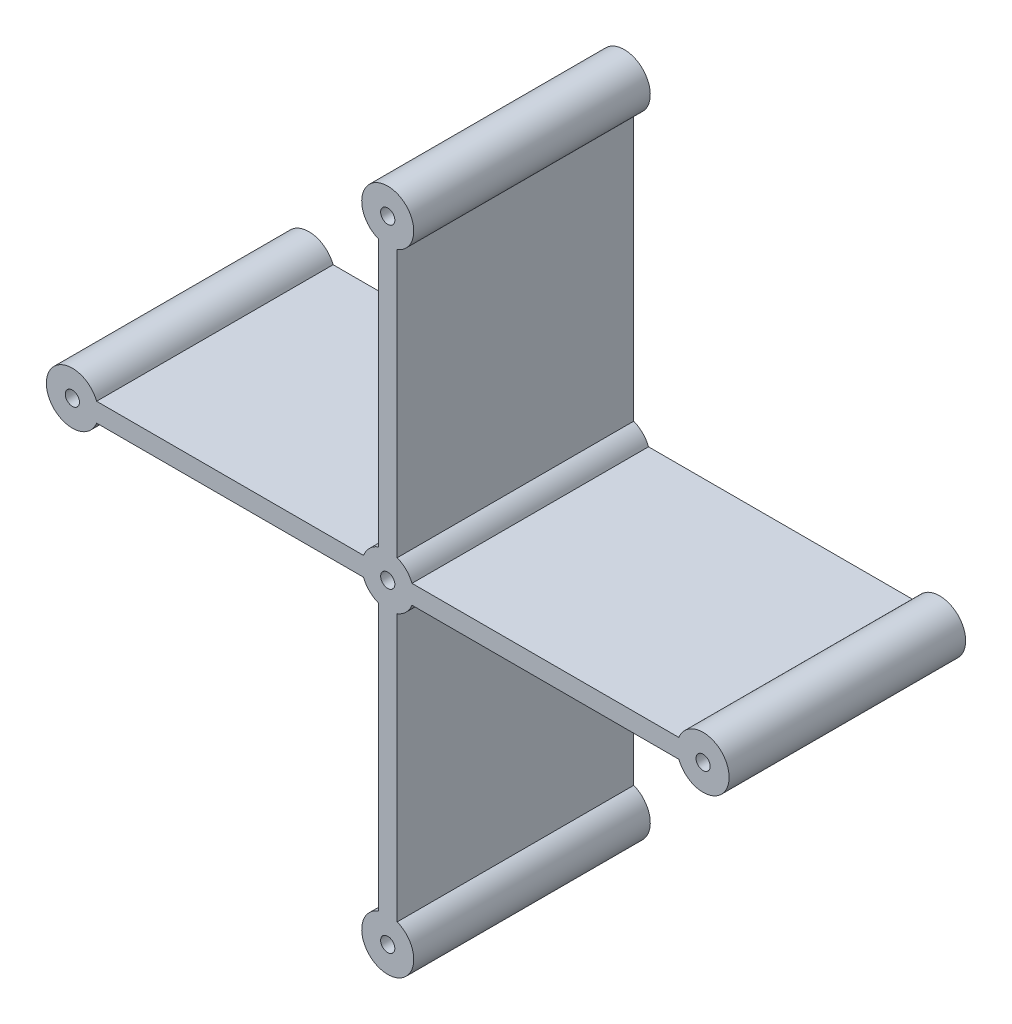
ISO-10303-21;
HEADER;
FILE_DESCRIPTION(('STEP AP214'),'2;1');
FILE_NAME('part.step','',(''),(''),'','','');
FILE_SCHEMA(('AUTOMOTIVE_DESIGN { 1 0 10303 214 1 1 1 1 }'));
ENDSEC;
DATA;
#1=APPLICATION_CONTEXT('core data for automotive mechanical design processes');
#2=APPLICATION_PROTOCOL_DEFINITION('international standard','automotive_design',2000,#1);
#3=PRODUCT_CONTEXT('',#1,'mechanical');
#4=PRODUCT('Part','Part','',(#3));
#5=PRODUCT_RELATED_PRODUCT_CATEGORY('part','',(#4));
#6=PRODUCT_DEFINITION_FORMATION('','',#4);
#7=PRODUCT_DEFINITION_CONTEXT('part definition',#1,'design');
#8=PRODUCT_DEFINITION('design','',#6,#7);
#9=PRODUCT_DEFINITION_SHAPE('','',#8);
#10=(LENGTH_UNIT() NAMED_UNIT(*) SI_UNIT(.MILLI.,.METRE.));
#11=(NAMED_UNIT(*) PLANE_ANGLE_UNIT() SI_UNIT($,.RADIAN.));
#12=(NAMED_UNIT(*) SI_UNIT($,.STERADIAN.) SOLID_ANGLE_UNIT());
#13=UNCERTAINTY_MEASURE_WITH_UNIT(LENGTH_MEASURE(1.E-05),#10,'distance_accuracy_value','');
#14=(GEOMETRIC_REPRESENTATION_CONTEXT(3) GLOBAL_UNCERTAINTY_ASSIGNED_CONTEXT((#13)) GLOBAL_UNIT_ASSIGNED_CONTEXT((#10,
#11,#12)) REPRESENTATION_CONTEXT('',''));
#15=CARTESIAN_POINT('',(0.,0.,0.));
#16=DIRECTION('',(0.,0.,1.));
#17=DIRECTION('',(1.,0.,0.));
#18=AXIS2_PLACEMENT_3D('',#15,#16,#17);
#19=CARTESIAN_POINT('',(-1.2,0.,30.));
#20=DIRECTION('',(-1.,0.,0.));
#21=DIRECTION('',(0.,-1.,0.));
#22=AXIS2_PLACEMENT_3D('',#19,#20,#21);
#23=PLANE('',#22);
#24=DIRECTION('',(0.,1.,0.));
#25=VECTOR('',#24,1.);
#26=CARTESIAN_POINT('',(-1.2,0.,0.));
#27=LINE('',#26,#25);
#28=CARTESIAN_POINT('',(-1.2,3.07408522978788,0.));
#29=VERTEX_POINT('',#28);
#30=CARTESIAN_POINT('',(-1.2,36.9259147702121,0.));
#31=VERTEX_POINT('',#30);
#32=EDGE_CURVE('E525',#29,#31,#27,.T.);
#33=ORIENTED_EDGE('',*,*,#32,.F.);
#34=DIRECTION('',(0.,0.,-1.));
#35=VECTOR('',#34,1.);
#36=CARTESIAN_POINT('',(-1.2,3.07408522978788,30.));
#37=LINE('',#36,#35);
#38=CARTESIAN_POINT('',(-1.2,3.07408522978788,30.));
#39=VERTEX_POINT('',#38);
#40=EDGE_CURVE('E513',#29,#39,#37,.F.);
#41=ORIENTED_EDGE('',*,*,#40,.T.);
#42=DIRECTION('',(0.,1.,0.));
#43=VECTOR('',#42,1.);
#44=CARTESIAN_POINT('',(-1.2,0.,30.));
#45=LINE('',#44,#43);
#46=CARTESIAN_POINT('',(-1.2,36.9259147702121,30.));
#47=VERTEX_POINT('',#46);
#48=EDGE_CURVE('E514',#39,#47,#45,.T.);
#49=ORIENTED_EDGE('',*,*,#48,.T.);
#50=DIRECTION('',(0.,0.,-1.));
#51=VECTOR('',#50,1.);
#52=CARTESIAN_POINT('',(-1.2,36.9259147702121,30.));
#53=LINE('',#52,#51);
#54=EDGE_CURVE('E321',#47,#31,#53,.T.);
#55=ORIENTED_EDGE('',*,*,#54,.T.);
#56=EDGE_LOOP('',(#33,#41,#49,#55));
#57=FACE_BOUND('',#56,.T.);
#58=ADVANCED_FACE('F303',(#57),#23,.T.);
#59=CARTESIAN_POINT('',(1.2,0.,30.));
#60=DIRECTION('',(-1.,0.,0.));
#61=DIRECTION('',(0.,-1.,0.));
#62=AXIS2_PLACEMENT_3D('',#59,#60,#61);
#63=PLANE('',#62);
#64=DIRECTION('',(0.,0.,-1.));
#65=VECTOR('',#64,1.);
#66=CARTESIAN_POINT('',(1.2,3.07408522978788,30.));
#67=LINE('',#66,#65);
#68=CARTESIAN_POINT('',(1.2,3.07408522978788,0.));
#69=VERTEX_POINT('',#68);
#70=CARTESIAN_POINT('',(1.2,3.07408522978788,30.));
#71=VERTEX_POINT('',#70);
#72=EDGE_CURVE('E12',#69,#71,#67,.F.);
#73=ORIENTED_EDGE('',*,*,#72,.F.);
#74=DIRECTION('',(0.,1.,0.));
#75=VECTOR('',#74,1.);
#76=CARTESIAN_POINT('',(1.2,0.,0.));
#77=LINE('',#76,#75);
#78=CARTESIAN_POINT('',(1.2,36.9259147702121,0.));
#79=VERTEX_POINT('',#78);
#80=EDGE_CURVE('E510',#69,#79,#77,.T.);
#81=ORIENTED_EDGE('',*,*,#80,.T.);
#82=DIRECTION('',(0.,0.,-1.));
#83=VECTOR('',#82,1.);
#84=CARTESIAN_POINT('',(1.2,36.9259147702121,30.));
#85=LINE('',#84,#83);
#86=CARTESIAN_POINT('',(1.2,36.9259147702121,30.));
#87=VERTEX_POINT('',#86);
#88=EDGE_CURVE('E313',#87,#79,#85,.T.);
#89=ORIENTED_EDGE('',*,*,#88,.F.);
#90=DIRECTION('',(0.,1.,0.));
#91=VECTOR('',#90,1.);
#92=CARTESIAN_POINT('',(1.2,0.,30.));
#93=LINE('',#92,#91);
#94=EDGE_CURVE('E532',#71,#87,#93,.T.);
#95=ORIENTED_EDGE('',*,*,#94,.F.);
#96=EDGE_LOOP('',(#73,#81,#89,#95));
#97=FACE_BOUND('',#96,.T.);
#98=ADVANCED_FACE('F608',(#97),#63,.F.);
#99=CARTESIAN_POINT('',(0.,0.,0.));
#100=DIRECTION('',(0.,0.,1.));
#101=DIRECTION('',(1.,0.,0.));
#102=AXIS2_PLACEMENT_3D('',#99,#100,#101);
#103=PLANE('',#102);
#104=CARTESIAN_POINT('',(0.,-40.,0.));
#105=DIRECTION('',(0.,0.,1.));
#106=DIRECTION('',(1.,0.,0.));
#107=AXIS2_PLACEMENT_3D('',#104,#105,#106);
#108=CIRCLE('',#107,0.899999999999998);
#109=CARTESIAN_POINT('',(0.900000000000008,-40.,0.));
#110=VERTEX_POINT('',#109);
#111=EDGE_CURVE('E686',#110,#110,#108,.T.);
#112=ORIENTED_EDGE('',*,*,#111,.T.);
#113=EDGE_LOOP('',(#112));
#114=FACE_BOUND('',#113,.T.);
#115=CARTESIAN_POINT('',(0.,40.,0.));
#116=DIRECTION('',(0.,0.,1.));
#117=DIRECTION('',(1.,0.,0.));
#118=AXIS2_PLACEMENT_3D('',#115,#116,#117);
#119=CIRCLE('',#118,0.899999999999998);
#120=CARTESIAN_POINT('',(0.899999999999993,40.,0.));
#121=VERTEX_POINT('',#120);
#122=EDGE_CURVE('E713',#121,#121,#119,.T.);
#123=ORIENTED_EDGE('',*,*,#122,.T.);
#124=EDGE_LOOP('',(#123));
#125=FACE_BOUND('',#124,.T.);
#126=CARTESIAN_POINT('',(-40.,0.,0.));
#127=DIRECTION('',(0.,0.,1.));
#128=DIRECTION('',(1.,0.,0.));
#129=AXIS2_PLACEMENT_3D('',#126,#127,#128);
#130=CIRCLE('',#129,0.899999999999997);
#131=CARTESIAN_POINT('',(-39.1,0.,0.));
#132=VERTEX_POINT('',#131);
#133=EDGE_CURVE('E706',#132,#132,#130,.T.);
#134=ORIENTED_EDGE('',*,*,#133,.T.);
#135=EDGE_LOOP('',(#134));
#136=FACE_BOUND('',#135,.T.);
#137=CARTESIAN_POINT('',(0.,0.,0.));
#138=DIRECTION('',(0.,0.,1.));
#139=DIRECTION('',(1.,0.,0.));
#140=AXIS2_PLACEMENT_3D('',#137,#138,#139);
#141=CIRCLE('',#140,0.9);
#142=CARTESIAN_POINT('',(0.9,0.,0.));
#143=VERTEX_POINT('',#142);
#144=EDGE_CURVE('E698',#143,#143,#141,.T.);
#145=ORIENTED_EDGE('',*,*,#144,.T.);
#146=EDGE_LOOP('',(#145));
#147=FACE_BOUND('',#146,.T.);
#148=CARTESIAN_POINT('',(40.,0.,0.));
#149=DIRECTION('',(0.,0.,1.));
#150=DIRECTION('',(1.,0.,0.));
#151=AXIS2_PLACEMENT_3D('',#148,#149,#150);
#152=CIRCLE('',#151,0.899999999999997);
#153=CARTESIAN_POINT('',(40.9,0.,0.));
#154=VERTEX_POINT('',#153);
#155=EDGE_CURVE('E690',#154,#154,#152,.T.);
#156=ORIENTED_EDGE('',*,*,#155,.T.);
#157=EDGE_LOOP('',(#156));
#158=FACE_BOUND('',#157,.T.);
#159=DIRECTION('',(-1.,0.,0.));
#160=VECTOR('',#159,1.);
#161=CARTESIAN_POINT('',(0.,1.2,0.));
#162=LINE('',#161,#160);
#163=CARTESIAN_POINT('',(-3.07408522978788,1.2,0.));
#164=VERTEX_POINT('',#163);
#165=CARTESIAN_POINT('',(-36.9259147702121,1.2,0.));
#166=VERTEX_POINT('',#165);
#167=EDGE_CURVE('E432',#164,#166,#162,.T.);
#168=ORIENTED_EDGE('',*,*,#167,.F.);
#169=CARTESIAN_POINT('',(0.,0.,0.));
#170=DIRECTION('',(0.,0.,1.));
#171=DIRECTION('',(1.,0.,0.));
#172=AXIS2_PLACEMENT_3D('',#169,#170,#171);
#173=CIRCLE('',#172,3.3);
#174=EDGE_CURVE('E448',#29,#164,#173,.T.);
#175=ORIENTED_EDGE('',*,*,#174,.F.);
#176=ORIENTED_EDGE('',*,*,#32,.T.);
#177=CARTESIAN_POINT('',(0.,40.,0.));
#178=DIRECTION('',(0.,0.,1.));
#179=DIRECTION('',(1.,0.,0.));
#180=AXIS2_PLACEMENT_3D('',#177,#178,#179);
#181=CIRCLE('',#180,3.3);
#182=EDGE_CURVE('E452',#79,#31,#181,.T.);
#183=ORIENTED_EDGE('',*,*,#182,.F.);
#184=ORIENTED_EDGE('',*,*,#80,.F.);
#185=CARTESIAN_POINT('',(3.07408522978788,1.2,0.));
#186=VERTEX_POINT('',#185);
#187=EDGE_CURVE('E670',#186,#69,#173,.T.);
#188=ORIENTED_EDGE('',*,*,#187,.F.);
#189=DIRECTION('',(1.,0.,0.));
#190=VECTOR('',#189,1.);
#191=CARTESIAN_POINT('',(0.,1.2,0.));
#192=LINE('',#191,#190);
#193=CARTESIAN_POINT('',(36.9259147702121,1.20000000000001,0.));
#194=VERTEX_POINT('',#193);
#195=EDGE_CURVE('E547',#186,#194,#192,.T.);
#196=ORIENTED_EDGE('',*,*,#195,.T.);
#197=CARTESIAN_POINT('',(40.,0.,0.));
#198=DIRECTION('',(0.,0.,1.));
#199=DIRECTION('',(1.,0.,0.));
#200=AXIS2_PLACEMENT_3D('',#197,#198,#199);
#201=CIRCLE('',#200,3.3);
#202=CARTESIAN_POINT('',(36.9259147702121,-1.19999999999999,0.));
#203=VERTEX_POINT('',#202);
#204=EDGE_CURVE('E459',#203,#194,#201,.T.);
#205=ORIENTED_EDGE('',*,*,#204,.F.);
#206=DIRECTION('',(1.,0.,0.));
#207=VECTOR('',#206,1.);
#208=CARTESIAN_POINT('',(0.,-1.2,0.));
#209=LINE('',#208,#207);
#210=CARTESIAN_POINT('',(3.07408522978788,-1.2,0.));
#211=VERTEX_POINT('',#210);
#212=EDGE_CURVE('E496',#211,#203,#209,.T.);
#213=ORIENTED_EDGE('',*,*,#212,.F.);
#214=CARTESIAN_POINT('',(1.2,-3.07408522978788,0.));
#215=VERTEX_POINT('',#214);
#216=EDGE_CURVE('E447',#215,#211,#173,.T.);
#217=ORIENTED_EDGE('',*,*,#216,.F.);
#218=DIRECTION('',(0.,-1.,0.));
#219=VECTOR('',#218,1.);
#220=CARTESIAN_POINT('',(1.2,0.,0.));
#221=LINE('',#220,#219);
#222=CARTESIAN_POINT('',(1.20000000000001,-36.9259147702121,0.));
#223=VERTEX_POINT('',#222);
#224=EDGE_CURVE('E561',#215,#223,#221,.T.);
#225=ORIENTED_EDGE('',*,*,#224,.T.);
#226=CARTESIAN_POINT('',(0.,-40.,0.));
#227=DIRECTION('',(0.,0.,1.));
#228=DIRECTION('',(1.,0.,0.));
#229=AXIS2_PLACEMENT_3D('',#226,#227,#228);
#230=CIRCLE('',#229,3.3);
#231=CARTESIAN_POINT('',(-1.2,-36.9259147702121,0.));
#232=VERTEX_POINT('',#231);
#233=EDGE_CURVE('E422',#232,#223,#230,.T.);
#234=ORIENTED_EDGE('',*,*,#233,.F.);
#235=DIRECTION('',(0.,-1.,0.));
#236=VECTOR('',#235,1.);
#237=CARTESIAN_POINT('',(-1.2,0.,0.));
#238=LINE('',#237,#236);
#239=CARTESIAN_POINT('',(-1.2,-3.07408522978788,0.));
#240=VERTEX_POINT('',#239);
#241=EDGE_CURVE('E482',#240,#232,#238,.T.);
#242=ORIENTED_EDGE('',*,*,#241,.F.);
#243=CARTESIAN_POINT('',(-3.07408522978788,-1.2,0.));
#244=VERTEX_POINT('',#243);
#245=EDGE_CURVE('E443',#244,#240,#173,.T.);
#246=ORIENTED_EDGE('',*,*,#245,.F.);
#247=DIRECTION('',(-1.,0.,0.));
#248=VECTOR('',#247,1.);
#249=CARTESIAN_POINT('',(0.,-1.2,0.));
#250=LINE('',#249,#248);
#251=CARTESIAN_POINT('',(-36.9259147702121,-1.20000000000001,0.));
#252=VERTEX_POINT('',#251);
#253=EDGE_CURVE('E428',#244,#252,#250,.T.);
#254=ORIENTED_EDGE('',*,*,#253,.T.);
#255=CARTESIAN_POINT('',(-40.,0.,0.));
#256=DIRECTION('',(0.,0.,1.));
#257=DIRECTION('',(1.,0.,0.));
#258=AXIS2_PLACEMENT_3D('',#255,#256,#257);
#259=CIRCLE('',#258,3.3);
#260=EDGE_CURVE('E410',#166,#252,#259,.T.);
#261=ORIENTED_EDGE('',*,*,#260,.F.);
#262=EDGE_LOOP('',(#168,#175,#176,#183,#184,#188,#196,#205,#213,#217,#225,#234,#242,#246,#254,#261));
#263=FACE_BOUND('',#262,.T.);
#264=ADVANCED_FACE('F574',(#114,#125,#136,#147,#158,#263),#103,.F.);
#265=CARTESIAN_POINT('',(0.,0.,30.));
#266=DIRECTION('',(0.,0.,1.));
#267=DIRECTION('',(1.,0.,0.));
#268=AXIS2_PLACEMENT_3D('',#265,#266,#267);
#269=PLANE('',#268);
#270=CARTESIAN_POINT('',(0.,-40.,30.));
#271=DIRECTION('',(0.,0.,1.));
#272=DIRECTION('',(1.,0.,0.));
#273=AXIS2_PLACEMENT_3D('',#270,#271,#272);
#274=CIRCLE('',#273,0.899999999999998);
#275=CARTESIAN_POINT('',(0.900000000000008,-40.,30.));
#276=VERTEX_POINT('',#275);
#277=EDGE_CURVE('E471',#276,#276,#274,.T.);
#278=ORIENTED_EDGE('',*,*,#277,.F.);
#279=EDGE_LOOP('',(#278));
#280=FACE_BOUND('',#279,.T.);
#281=CARTESIAN_POINT('',(0.,40.,30.));
#282=DIRECTION('',(0.,0.,1.));
#283=DIRECTION('',(1.,0.,0.));
#284=AXIS2_PLACEMENT_3D('',#281,#282,#283);
#285=CIRCLE('',#284,0.899999999999998);
#286=CARTESIAN_POINT('',(0.899999999999993,40.,30.));
#287=VERTEX_POINT('',#286);
#288=EDGE_CURVE('E717',#287,#287,#285,.T.);
#289=ORIENTED_EDGE('',*,*,#288,.F.);
#290=EDGE_LOOP('',(#289));
#291=FACE_BOUND('',#290,.T.);
#292=CARTESIAN_POINT('',(-40.,0.,30.));
#293=DIRECTION('',(0.,0.,1.));
#294=DIRECTION('',(1.,0.,0.));
#295=AXIS2_PLACEMENT_3D('',#292,#293,#294);
#296=CIRCLE('',#295,0.899999999999997);
#297=CARTESIAN_POINT('',(-39.1,0.,30.));
#298=VERTEX_POINT('',#297);
#299=EDGE_CURVE('E709',#298,#298,#296,.T.);
#300=ORIENTED_EDGE('',*,*,#299,.F.);
#301=EDGE_LOOP('',(#300));
#302=FACE_BOUND('',#301,.T.);
#303=CARTESIAN_POINT('',(0.,0.,30.));
#304=DIRECTION('',(0.,0.,1.));
#305=DIRECTION('',(1.,0.,0.));
#306=AXIS2_PLACEMENT_3D('',#303,#304,#305);
#307=CIRCLE('',#306,0.9);
#308=CARTESIAN_POINT('',(0.9,0.,30.));
#309=VERTEX_POINT('',#308);
#310=EDGE_CURVE('E702',#309,#309,#307,.T.);
#311=ORIENTED_EDGE('',*,*,#310,.F.);
#312=EDGE_LOOP('',(#311));
#313=FACE_BOUND('',#312,.T.);
#314=CARTESIAN_POINT('',(40.,0.,30.));
#315=DIRECTION('',(0.,0.,1.));
#316=DIRECTION('',(1.,0.,0.));
#317=AXIS2_PLACEMENT_3D('',#314,#315,#316);
#318=CIRCLE('',#317,0.899999999999997);
#319=CARTESIAN_POINT('',(40.9,0.,30.));
#320=VERTEX_POINT('',#319);
#321=EDGE_CURVE('E694',#320,#320,#318,.T.);
#322=ORIENTED_EDGE('',*,*,#321,.F.);
#323=EDGE_LOOP('',(#322));
#324=FACE_BOUND('',#323,.T.);
#325=CARTESIAN_POINT('',(0.,0.,30.));
#326=DIRECTION('',(0.,0.,1.));
#327=DIRECTION('',(1.,0.,0.));
#328=AXIS2_PLACEMENT_3D('',#325,#326,#327);
#329=CIRCLE('',#328,3.3);
#330=CARTESIAN_POINT('',(-3.07408522978788,1.2,30.));
#331=VERTEX_POINT('',#330);
#332=EDGE_CURVE('E439',#39,#331,#329,.T.);
#333=ORIENTED_EDGE('',*,*,#332,.T.);
#334=DIRECTION('',(-1.,0.,0.));
#335=VECTOR('',#334,1.);
#336=CARTESIAN_POINT('',(0.,1.2,30.));
#337=LINE('',#336,#335);
#338=CARTESIAN_POINT('',(-36.9259147702121,1.2,30.));
#339=VERTEX_POINT('',#338);
#340=EDGE_CURVE('E420',#331,#339,#337,.T.);
#341=ORIENTED_EDGE('',*,*,#340,.T.);
#342=CARTESIAN_POINT('',(-40.,0.,30.));
#343=DIRECTION('',(0.,0.,1.));
#344=DIRECTION('',(1.,0.,0.));
#345=AXIS2_PLACEMENT_3D('',#342,#343,#344);
#346=CIRCLE('',#345,3.3);
#347=CARTESIAN_POINT('',(-36.9259147702121,-1.20000000000001,30.));
#348=VERTEX_POINT('',#347);
#349=EDGE_CURVE('E407',#339,#348,#346,.T.);
#350=ORIENTED_EDGE('',*,*,#349,.T.);
#351=DIRECTION('',(-1.,0.,0.));
#352=VECTOR('',#351,1.);
#353=CARTESIAN_POINT('',(0.,-1.2,30.));
#354=LINE('',#353,#352);
#355=CARTESIAN_POINT('',(-3.07408522978788,-1.2,30.));
#356=VERTEX_POINT('',#355);
#357=EDGE_CURVE('E413',#356,#348,#354,.T.);
#358=ORIENTED_EDGE('',*,*,#357,.F.);
#359=CARTESIAN_POINT('',(-1.2,-3.07408522978788,30.));
#360=VERTEX_POINT('',#359);
#361=EDGE_CURVE('E436',#356,#360,#329,.T.);
#362=ORIENTED_EDGE('',*,*,#361,.T.);
#363=DIRECTION('',(0.,-1.,0.));
#364=VECTOR('',#363,1.);
#365=CARTESIAN_POINT('',(-1.2,0.,30.));
#366=LINE('',#365,#364);
#367=CARTESIAN_POINT('',(-1.2,-36.9259147702121,30.));
#368=VERTEX_POINT('',#367);
#369=EDGE_CURVE('E557',#360,#368,#366,.T.);
#370=ORIENTED_EDGE('',*,*,#369,.T.);
#371=CARTESIAN_POINT('',(0.,-40.,30.));
#372=DIRECTION('',(0.,0.,1.));
#373=DIRECTION('',(1.,0.,0.));
#374=AXIS2_PLACEMENT_3D('',#371,#372,#373);
#375=CIRCLE('',#374,3.3);
#376=CARTESIAN_POINT('',(1.20000000000001,-36.9259147702121,30.));
#377=VERTEX_POINT('',#376);
#378=EDGE_CURVE('E463',#368,#377,#375,.T.);
#379=ORIENTED_EDGE('',*,*,#378,.T.);
#380=DIRECTION('',(0.,-1.,0.));
#381=VECTOR('',#380,1.);
#382=CARTESIAN_POINT('',(1.2,0.,30.));
#383=LINE('',#382,#381);
#384=CARTESIAN_POINT('',(1.2,-3.07408522978788,30.));
#385=VERTEX_POINT('',#384);
#386=EDGE_CURVE('E487',#385,#377,#383,.T.);
#387=ORIENTED_EDGE('',*,*,#386,.F.);
#388=CARTESIAN_POINT('',(3.07408522978788,-1.2,30.));
#389=VERTEX_POINT('',#388);
#390=EDGE_CURVE('E592',#385,#389,#329,.T.);
#391=ORIENTED_EDGE('',*,*,#390,.T.);
#392=DIRECTION('',(1.,0.,0.));
#393=VECTOR('',#392,1.);
#394=CARTESIAN_POINT('',(0.,-1.2,30.));
#395=LINE('',#394,#393);
#396=CARTESIAN_POINT('',(36.9259147702121,-1.19999999999999,30.));
#397=VERTEX_POINT('',#396);
#398=EDGE_CURVE('E543',#389,#397,#395,.T.);
#399=ORIENTED_EDGE('',*,*,#398,.T.);
#400=CARTESIAN_POINT('',(40.,0.,30.));
#401=DIRECTION('',(0.,0.,1.));
#402=DIRECTION('',(1.,0.,0.));
#403=AXIS2_PLACEMENT_3D('',#400,#401,#402);
#404=CIRCLE('',#403,3.3);
#405=CARTESIAN_POINT('',(36.9259147702121,1.20000000000001,30.));
#406=VERTEX_POINT('',#405);
#407=EDGE_CURVE('E455',#397,#406,#404,.T.);
#408=ORIENTED_EDGE('',*,*,#407,.T.);
#409=DIRECTION('',(1.,0.,0.));
#410=VECTOR('',#409,1.);
#411=CARTESIAN_POINT('',(0.,1.2,30.));
#412=LINE('',#411,#410);
#413=CARTESIAN_POINT('',(3.07408522978788,1.2,30.));
#414=VERTEX_POINT('',#413);
#415=EDGE_CURVE('E501',#414,#406,#412,.T.);
#416=ORIENTED_EDGE('',*,*,#415,.F.);
#417=EDGE_CURVE('E442',#414,#71,#329,.T.);
#418=ORIENTED_EDGE('',*,*,#417,.T.);
#419=ORIENTED_EDGE('',*,*,#94,.T.);
#420=CARTESIAN_POINT('',(0.,40.,30.));
#421=DIRECTION('',(0.,0.,1.));
#422=DIRECTION('',(1.,0.,0.));
#423=AXIS2_PLACEMENT_3D('',#420,#421,#422);
#424=CIRCLE('',#423,3.3);
#425=EDGE_CURVE('E449',#87,#47,#424,.T.);
#426=ORIENTED_EDGE('',*,*,#425,.T.);
#427=ORIENTED_EDGE('',*,*,#48,.F.);
#428=EDGE_LOOP('',(#333,#341,#350,#358,#362,#370,#379,#387,#391,#399,#408,#416,#418,#419,#426,#427));
#429=FACE_BOUND('',#428,.T.);
#430=ADVANCED_FACE('F417',(#280,#291,#302,#313,#324,#429),#269,.T.);
#431=CARTESIAN_POINT('',(0.,40.,30.));
#432=DIRECTION('',(0.,0.,-1.));
#433=DIRECTION('',(-1.,0.,0.));
#434=AXIS2_PLACEMENT_3D('',#431,#432,#433);
#435=CYLINDRICAL_SURFACE('',#434,3.3);
#436=ORIENTED_EDGE('',*,*,#425,.F.);
#437=ORIENTED_EDGE('',*,*,#88,.T.);
#438=ORIENTED_EDGE('',*,*,#182,.T.);
#439=ORIENTED_EDGE('',*,*,#54,.F.);
#440=EDGE_LOOP('',(#436,#437,#438,#439));
#441=FACE_BOUND('',#440,.T.);
#442=ADVANCED_FACE('F613',(#441),#435,.T.);
#443=CARTESIAN_POINT('',(0.,-40.,30.));
#444=DIRECTION('',(0.,0.,-1.));
#445=DIRECTION('',(-1.,0.,0.));
#446=AXIS2_PLACEMENT_3D('',#443,#444,#445);
#447=CYLINDRICAL_SURFACE('',#446,3.3);
#448=ORIENTED_EDGE('',*,*,#378,.F.);
#449=DIRECTION('',(0.,0.,-1.));
#450=VECTOR('',#449,1.);
#451=CARTESIAN_POINT('',(-1.2,-36.9259147702121,30.));
#452=LINE('',#451,#450);
#453=EDGE_CURVE('E488',#368,#232,#452,.T.);
#454=ORIENTED_EDGE('',*,*,#453,.T.);
#455=ORIENTED_EDGE('',*,*,#233,.T.);
#456=DIRECTION('',(0.,0.,-1.));
#457=VECTOR('',#456,1.);
#458=CARTESIAN_POINT('',(1.20000000000001,-36.9259147702121,30.));
#459=LINE('',#458,#457);
#460=EDGE_CURVE('E483',#377,#223,#459,.T.);
#461=ORIENTED_EDGE('',*,*,#460,.F.);
#462=EDGE_LOOP('',(#448,#454,#455,#461));
#463=FACE_BOUND('',#462,.T.);
#464=ADVANCED_FACE('F584',(#463),#447,.T.);
#465=CARTESIAN_POINT('',(1.2,0.,30.));
#466=DIRECTION('',(1.,0.,0.));
#467=DIRECTION('',(0.,1.,0.));
#468=AXIS2_PLACEMENT_3D('',#465,#466,#467);
#469=PLANE('',#468);
#470=ORIENTED_EDGE('',*,*,#224,.F.);
#471=DIRECTION('',(0.,0.,-1.));
#472=VECTOR('',#471,1.);
#473=CARTESIAN_POINT('',(1.2,-3.07408522978788,30.));
#474=LINE('',#473,#472);
#475=EDGE_CURVE('E486',#215,#385,#474,.F.);
#476=ORIENTED_EDGE('',*,*,#475,.T.);
#477=ORIENTED_EDGE('',*,*,#386,.T.);
#478=ORIENTED_EDGE('',*,*,#460,.T.);
#479=EDGE_LOOP('',(#470,#476,#477,#478));
#480=FACE_BOUND('',#479,.T.);
#481=ADVANCED_FACE('F579',(#480),#469,.T.);
#482=CARTESIAN_POINT('',(-1.2,0.,30.));
#483=DIRECTION('',(1.,0.,0.));
#484=DIRECTION('',(0.,1.,0.));
#485=AXIS2_PLACEMENT_3D('',#482,#483,#484);
#486=PLANE('',#485);
#487=DIRECTION('',(0.,0.,-1.));
#488=VECTOR('',#487,1.);
#489=CARTESIAN_POINT('',(-1.2,-3.07408522978788,30.));
#490=LINE('',#489,#488);
#491=EDGE_CURVE('E491',#240,#360,#490,.F.);
#492=ORIENTED_EDGE('',*,*,#491,.F.);
#493=ORIENTED_EDGE('',*,*,#241,.T.);
#494=ORIENTED_EDGE('',*,*,#453,.F.);
#495=ORIENTED_EDGE('',*,*,#369,.F.);
#496=EDGE_LOOP('',(#492,#493,#494,#495));
#497=FACE_BOUND('',#496,.T.);
#498=ADVANCED_FACE('F587',(#497),#486,.F.);
#499=CARTESIAN_POINT('',(40.,0.,30.));
#500=DIRECTION('',(0.,0.,-1.));
#501=DIRECTION('',(-1.,0.,0.));
#502=AXIS2_PLACEMENT_3D('',#499,#500,#501);
#503=CYLINDRICAL_SURFACE('',#502,3.3);
#504=ORIENTED_EDGE('',*,*,#407,.F.);
#505=DIRECTION('',(0.,0.,-1.));
#506=VECTOR('',#505,1.);
#507=CARTESIAN_POINT('',(36.9259147702121,-1.19999999999999,30.));
#508=LINE('',#507,#506);
#509=EDGE_CURVE('E502',#397,#203,#508,.T.);
#510=ORIENTED_EDGE('',*,*,#509,.T.);
#511=ORIENTED_EDGE('',*,*,#204,.T.);
#512=DIRECTION('',(0.,0.,-1.));
#513=VECTOR('',#512,1.);
#514=CARTESIAN_POINT('',(36.9259147702121,1.20000000000001,30.));
#515=LINE('',#514,#513);
#516=EDGE_CURVE('E497',#406,#194,#515,.T.);
#517=ORIENTED_EDGE('',*,*,#516,.F.);
#518=EDGE_LOOP('',(#504,#510,#511,#517));
#519=FACE_BOUND('',#518,.T.);
#520=ADVANCED_FACE('F646',(#519),#503,.T.);
#521=CARTESIAN_POINT('',(-40.,0.,30.));
#522=DIRECTION('',(0.,0.,-1.));
#523=DIRECTION('',(-1.,0.,0.));
#524=AXIS2_PLACEMENT_3D('',#521,#522,#523);
#525=CYLINDRICAL_SURFACE('',#524,3.3);
#526=ORIENTED_EDGE('',*,*,#349,.F.);
#527=DIRECTION('',(0.,0.,-1.));
#528=VECTOR('',#527,1.);
#529=CARTESIAN_POINT('',(-36.9259147702121,1.2,30.));
#530=LINE('',#529,#528);
#531=EDGE_CURVE('E473',#339,#166,#530,.T.);
#532=ORIENTED_EDGE('',*,*,#531,.T.);
#533=ORIENTED_EDGE('',*,*,#260,.T.);
#534=DIRECTION('',(0.,0.,-1.));
#535=VECTOR('',#534,1.);
#536=CARTESIAN_POINT('',(-36.9259147702121,-1.20000000000001,30.));
#537=LINE('',#536,#535);
#538=EDGE_CURVE('E405',#348,#252,#537,.T.);
#539=ORIENTED_EDGE('',*,*,#538,.F.);
#540=EDGE_LOOP('',(#526,#532,#533,#539));
#541=FACE_BOUND('',#540,.T.);
#542=ADVANCED_FACE('F305',(#541),#525,.T.);
#543=CARTESIAN_POINT('',(0.,0.,30.));
#544=DIRECTION('',(0.,0.,-1.));
#545=DIRECTION('',(-1.,0.,0.));
#546=AXIS2_PLACEMENT_3D('',#543,#544,#545);
#547=CYLINDRICAL_SURFACE('',#546,3.3);
#548=ORIENTED_EDGE('',*,*,#216,.T.);
#549=DIRECTION('',(0.,0.,-1.));
#550=VECTOR('',#549,1.);
#551=CARTESIAN_POINT('',(3.07408522978788,-1.2,30.));
#552=LINE('',#551,#550);
#553=EDGE_CURVE('E505',#211,#389,#552,.F.);
#554=ORIENTED_EDGE('',*,*,#553,.T.);
#555=ORIENTED_EDGE('',*,*,#390,.F.);
#556=ORIENTED_EDGE('',*,*,#475,.F.);
#557=EDGE_LOOP('',(#548,#554,#555,#556));
#558=FACE_BOUND('',#557,.T.);
#559=ADVANCED_FACE('F640',(#558),#547,.T.);
#560=CARTESIAN_POINT('',(0.,-1.2,30.));
#561=DIRECTION('',(0.,1.,0.));
#562=DIRECTION('',(-1.,0.,0.));
#563=AXIS2_PLACEMENT_3D('',#560,#561,#562);
#564=PLANE('',#563);
#565=ORIENTED_EDGE('',*,*,#553,.F.);
#566=ORIENTED_EDGE('',*,*,#212,.T.);
#567=ORIENTED_EDGE('',*,*,#509,.F.);
#568=ORIENTED_EDGE('',*,*,#398,.F.);
#569=EDGE_LOOP('',(#565,#566,#567,#568));
#570=FACE_BOUND('',#569,.T.);
#571=ADVANCED_FACE('F637',(#570),#564,.F.);
#572=CARTESIAN_POINT('',(0.,-1.2,30.));
#573=DIRECTION('',(0.,-1.,0.));
#574=DIRECTION('',(1.,0.,0.));
#575=AXIS2_PLACEMENT_3D('',#572,#573,#574);
#576=PLANE('',#575);
#577=ORIENTED_EDGE('',*,*,#253,.F.);
#578=DIRECTION('',(0.,0.,-1.));
#579=VECTOR('',#578,1.);
#580=CARTESIAN_POINT('',(-3.07408522978788,-1.2,30.));
#581=LINE('',#580,#579);
#582=EDGE_CURVE('E399',#244,#356,#581,.F.);
#583=ORIENTED_EDGE('',*,*,#582,.T.);
#584=ORIENTED_EDGE('',*,*,#357,.T.);
#585=ORIENTED_EDGE('',*,*,#538,.T.);
#586=EDGE_LOOP('',(#577,#583,#584,#585));
#587=FACE_BOUND('',#586,.T.);
#588=ADVANCED_FACE('F424',(#587),#576,.T.);
#589=ORIENTED_EDGE('',*,*,#245,.T.);
#590=ORIENTED_EDGE('',*,*,#491,.T.);
#591=ORIENTED_EDGE('',*,*,#361,.F.);
#592=ORIENTED_EDGE('',*,*,#582,.F.);
#593=EDGE_LOOP('',(#589,#590,#591,#592));
#594=FACE_BOUND('',#593,.T.);
#595=ADVANCED_FACE('F590',(#594),#547,.T.);
#596=CARTESIAN_POINT('',(0.,1.2,30.));
#597=DIRECTION('',(0.,1.,0.));
#598=DIRECTION('',(-1.,0.,0.));
#599=AXIS2_PLACEMENT_3D('',#596,#597,#598);
#600=PLANE('',#599);
#601=ORIENTED_EDGE('',*,*,#195,.F.);
#602=DIRECTION('',(0.,0.,-1.));
#603=VECTOR('',#602,1.);
#604=CARTESIAN_POINT('',(3.07408522978788,1.2,30.));
#605=LINE('',#604,#603);
#606=EDGE_CURVE('E500',#186,#414,#605,.F.);
#607=ORIENTED_EDGE('',*,*,#606,.T.);
#608=ORIENTED_EDGE('',*,*,#415,.T.);
#609=ORIENTED_EDGE('',*,*,#516,.T.);
#610=EDGE_LOOP('',(#601,#607,#608,#609));
#611=FACE_BOUND('',#610,.T.);
#612=ADVANCED_FACE('F632',(#611),#600,.T.);
#613=CARTESIAN_POINT('',(0.,1.2,30.));
#614=DIRECTION('',(0.,-1.,0.));
#615=DIRECTION('',(1.,0.,0.));
#616=AXIS2_PLACEMENT_3D('',#613,#614,#615);
#617=PLANE('',#616);
#618=DIRECTION('',(0.,0.,-1.));
#619=VECTOR('',#618,1.);
#620=CARTESIAN_POINT('',(-3.07408522978788,1.2,30.));
#621=LINE('',#620,#619);
#622=EDGE_CURVE('E476',#164,#331,#621,.F.);
#623=ORIENTED_EDGE('',*,*,#622,.F.);
#624=ORIENTED_EDGE('',*,*,#167,.T.);
#625=ORIENTED_EDGE('',*,*,#531,.F.);
#626=ORIENTED_EDGE('',*,*,#340,.F.);
#627=EDGE_LOOP('',(#623,#624,#625,#626));
#628=FACE_BOUND('',#627,.T.);
#629=ADVANCED_FACE('F635',(#628),#617,.F.);
#630=ORIENTED_EDGE('',*,*,#187,.T.);
#631=ORIENTED_EDGE('',*,*,#72,.T.);
#632=ORIENTED_EDGE('',*,*,#417,.F.);
#633=ORIENTED_EDGE('',*,*,#606,.F.);
#634=EDGE_LOOP('',(#630,#631,#632,#633));
#635=FACE_BOUND('',#634,.T.);
#636=ADVANCED_FACE('F650',(#635),#547,.T.);
#637=ORIENTED_EDGE('',*,*,#40,.F.);
#638=ORIENTED_EDGE('',*,*,#174,.T.);
#639=ORIENTED_EDGE('',*,*,#622,.T.);
#640=ORIENTED_EDGE('',*,*,#332,.F.);
#641=EDGE_LOOP('',(#637,#638,#639,#640));
#642=FACE_BOUND('',#641,.T.);
#643=ADVANCED_FACE('F528',(#642),#547,.T.);
#644=CARTESIAN_POINT('',(40.,0.,30.));
#645=DIRECTION('',(0.,0.,-1.));
#646=DIRECTION('',(-1.,0.,0.));
#647=AXIS2_PLACEMENT_3D('',#644,#645,#646);
#648=CYLINDRICAL_SURFACE('',#647,0.899999999999997);
#649=ORIENTED_EDGE('',*,*,#321,.T.);
#650=EDGE_LOOP('',(#649));
#651=FACE_BOUND('',#650,.T.);
#652=ORIENTED_EDGE('',*,*,#155,.F.);
#653=EDGE_LOOP('',(#652));
#654=FACE_BOUND('',#653,.T.);
#655=ADVANCED_FACE('F653',(#651,#654),#648,.F.);
#656=CARTESIAN_POINT('',(0.,0.,30.));
#657=DIRECTION('',(0.,0.,-1.));
#658=DIRECTION('',(-1.,0.,0.));
#659=AXIS2_PLACEMENT_3D('',#656,#657,#658);
#660=CYLINDRICAL_SURFACE('',#659,0.9);
#661=ORIENTED_EDGE('',*,*,#310,.T.);
#662=EDGE_LOOP('',(#661));
#663=FACE_BOUND('',#662,.T.);
#664=ORIENTED_EDGE('',*,*,#144,.F.);
#665=EDGE_LOOP('',(#664));
#666=FACE_BOUND('',#665,.T.);
#667=ADVANCED_FACE('F658',(#663,#666),#660,.F.);
#668=CARTESIAN_POINT('',(-40.,0.,30.));
#669=DIRECTION('',(0.,0.,-1.));
#670=DIRECTION('',(-1.,0.,0.));
#671=AXIS2_PLACEMENT_3D('',#668,#669,#670);
#672=CYLINDRICAL_SURFACE('',#671,0.899999999999997);
#673=ORIENTED_EDGE('',*,*,#299,.T.);
#674=EDGE_LOOP('',(#673));
#675=FACE_BOUND('',#674,.T.);
#676=ORIENTED_EDGE('',*,*,#133,.F.);
#677=EDGE_LOOP('',(#676));
#678=FACE_BOUND('',#677,.T.);
#679=ADVANCED_FACE('F748',(#675,#678),#672,.F.);
#680=CARTESIAN_POINT('',(0.,40.,30.));
#681=DIRECTION('',(0.,0.,-1.));
#682=DIRECTION('',(-1.,0.,0.));
#683=AXIS2_PLACEMENT_3D('',#680,#681,#682);
#684=CYLINDRICAL_SURFACE('',#683,0.899999999999998);
#685=ORIENTED_EDGE('',*,*,#288,.T.);
#686=EDGE_LOOP('',(#685));
#687=FACE_BOUND('',#686,.T.);
#688=ORIENTED_EDGE('',*,*,#122,.F.);
#689=EDGE_LOOP('',(#688));
#690=FACE_BOUND('',#689,.T.);
#691=ADVANCED_FACE('F723',(#687,#690),#684,.F.);
#692=CARTESIAN_POINT('',(0.,-40.,30.));
#693=DIRECTION('',(0.,0.,-1.));
#694=DIRECTION('',(-1.,0.,0.));
#695=AXIS2_PLACEMENT_3D('',#692,#693,#694);
#696=CYLINDRICAL_SURFACE('',#695,0.899999999999998);
#697=ORIENTED_EDGE('',*,*,#277,.T.);
#698=EDGE_LOOP('',(#697));
#699=FACE_BOUND('',#698,.T.);
#700=ORIENTED_EDGE('',*,*,#111,.F.);
#701=EDGE_LOOP('',(#700));
#702=FACE_BOUND('',#701,.T.);
#703=ADVANCED_FACE('F758',(#699,#702),#696,.F.);
#704=CLOSED_SHELL('',(#58,#98,#264,#430,#442,#464,#481,#498,#520,#542,#559,#571,#588,#595,#612,
#629,#636,#643,#655,#667,#679,#691,#703));
#705=MANIFOLD_SOLID_BREP('B2',#704);
#706=ADVANCED_BREP_SHAPE_REPRESENTATION('',(#18,#705),#14);
#707=SHAPE_DEFINITION_REPRESENTATION(#9,#706);
ENDSEC;
END-ISO-10303-21;
